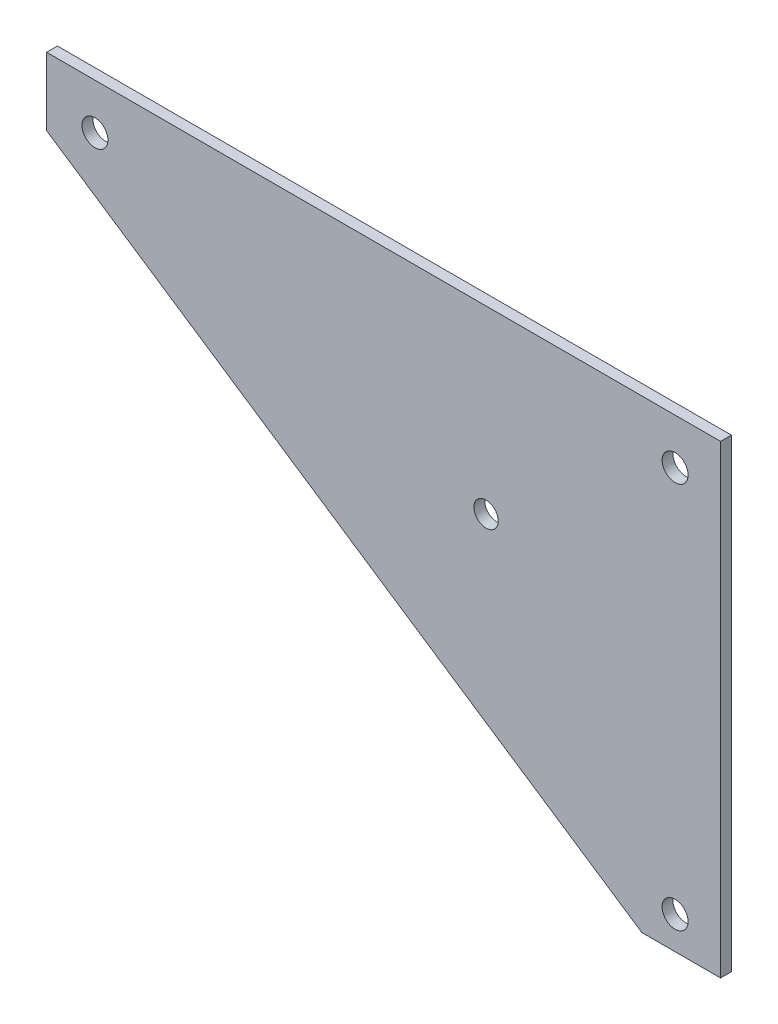
ISO-10303-21;
HEADER;
FILE_DESCRIPTION(('STEP AP214'),'2;1');
FILE_NAME('part.step','',(''),(''),'','','');
FILE_SCHEMA(('AUTOMOTIVE_DESIGN { 1 0 10303 214 1 1 1 1 }'));
ENDSEC;
DATA;
#1=APPLICATION_CONTEXT('core data for automotive mechanical design processes');
#2=APPLICATION_PROTOCOL_DEFINITION('international standard','automotive_design',2000,#1);
#3=PRODUCT_CONTEXT('',#1,'mechanical');
#4=PRODUCT('Part','Part','',(#3));
#5=PRODUCT_RELATED_PRODUCT_CATEGORY('part','',(#4));
#6=PRODUCT_DEFINITION_FORMATION('','',#4);
#7=PRODUCT_DEFINITION_CONTEXT('part definition',#1,'design');
#8=PRODUCT_DEFINITION('design','',#6,#7);
#9=PRODUCT_DEFINITION_SHAPE('','',#8);
#10=(LENGTH_UNIT() NAMED_UNIT(*) SI_UNIT(.MILLI.,.METRE.));
#11=(NAMED_UNIT(*) PLANE_ANGLE_UNIT() SI_UNIT($,.RADIAN.));
#12=(NAMED_UNIT(*) SI_UNIT($,.STERADIAN.) SOLID_ANGLE_UNIT());
#13=UNCERTAINTY_MEASURE_WITH_UNIT(LENGTH_MEASURE(1.E-05),#10,'distance_accuracy_value','');
#14=(GEOMETRIC_REPRESENTATION_CONTEXT(3) GLOBAL_UNCERTAINTY_ASSIGNED_CONTEXT((#13)) GLOBAL_UNIT_ASSIGNED_CONTEXT((#10,
#11,#12)) REPRESENTATION_CONTEXT('',''));
#15=CARTESIAN_POINT('',(0.,0.,0.));
#16=DIRECTION('',(0.,0.,1.));
#17=DIRECTION('',(1.,0.,0.));
#18=AXIS2_PLACEMENT_3D('',#15,#16,#17);
#19=CARTESIAN_POINT('',(-9.31896329658385,-13.9784449448758,4.));
#20=DIRECTION('',(-0.554700196225228,-0.832050294337844,0.));
#21=DIRECTION('',(0.832050294337844,-0.554700196225228,0.));
#22=AXIS2_PLACEMENT_3D('',#19,#20,#21);
#23=PLANE('',#22);
#24=DIRECTION('',(-0.832050294337844,0.554700196225228,0.));
#25=VECTOR('',#24,1.);
#26=CARTESIAN_POINT('',(-9.31896329658385,-13.9784449448758,0.));
#27=LINE('',#26,#25);
#28=CARTESIAN_POINT('',(94.8562264289598,-83.4285714285714,0.));
#29=VERTEX_POINT('',#28);
#30=CARTESIAN_POINT('',(-125.,63.1422461907349,0.));
#31=VERTEX_POINT('',#30);
#32=EDGE_CURVE('E123',#29,#31,#27,.T.);
#33=ORIENTED_EDGE('',*,*,#32,.F.);
#34=DIRECTION('',(0.,0.,-1.));
#35=VECTOR('',#34,1.);
#36=CARTESIAN_POINT('',(94.8562264289598,-83.4285714285714,4.));
#37=LINE('',#36,#35);
#38=CARTESIAN_POINT('',(94.8562264289598,-83.4285714285714,4.));
#39=VERTEX_POINT('',#38);
#40=EDGE_CURVE('E11',#39,#29,#37,.T.);
#41=ORIENTED_EDGE('',*,*,#40,.F.);
#42=DIRECTION('',(-0.832050294337844,0.554700196225228,0.));
#43=VECTOR('',#42,1.);
#44=CARTESIAN_POINT('',(-9.31896329658385,-13.9784449448758,4.));
#45=LINE('',#44,#43);
#46=CARTESIAN_POINT('',(-125.,63.1422461907349,4.));
#47=VERTEX_POINT('',#46);
#48=EDGE_CURVE('E142',#39,#47,#45,.T.);
#49=ORIENTED_EDGE('',*,*,#48,.T.);
#50=DIRECTION('',(0.,0.,-1.));
#51=VECTOR('',#50,1.);
#52=CARTESIAN_POINT('',(-125.,63.1422461907349,4.));
#53=LINE('',#52,#51);
#54=EDGE_CURVE('E79',#47,#31,#53,.T.);
#55=ORIENTED_EDGE('',*,*,#54,.T.);
#56=EDGE_LOOP('',(#33,#41,#49,#55));
#57=FACE_BOUND('',#56,.T.);
#58=ADVANCED_FACE('F37',(#57),#23,.T.);
#59=CARTESIAN_POINT('',(2.38832202213429E-13,-83.4285714285717,4.));
#60=DIRECTION('',(0.,-1.,0.));
#61=DIRECTION('',(1.,0.,0.));
#62=AXIS2_PLACEMENT_3D('',#59,#60,#61);
#63=PLANE('',#62);
#64=DIRECTION('',(-1.,0.,0.));
#65=VECTOR('',#64,1.);
#66=CARTESIAN_POINT('',(2.38832202213429E-13,-83.4285714285717,0.));
#67=LINE('',#66,#65);
#68=CARTESIAN_POINT('',(123.942857142857,-83.4285714285713,0.));
#69=VERTEX_POINT('',#68);
#70=EDGE_CURVE('E126',#69,#29,#67,.T.);
#71=ORIENTED_EDGE('',*,*,#70,.F.);
#72=DIRECTION('',(0.,0.,-1.));
#73=VECTOR('',#72,1.);
#74=CARTESIAN_POINT('',(123.942857142857,-83.4285714285713,4.));
#75=LINE('',#74,#73);
#76=CARTESIAN_POINT('',(123.942857142857,-83.4285714285713,4.));
#77=VERTEX_POINT('',#76);
#78=EDGE_CURVE('E46',#77,#69,#75,.T.);
#79=ORIENTED_EDGE('',*,*,#78,.F.);
#80=DIRECTION('',(-1.,0.,0.));
#81=VECTOR('',#80,1.);
#82=CARTESIAN_POINT('',(2.38832202213429E-13,-83.4285714285717,4.));
#83=LINE('',#82,#81);
#84=EDGE_CURVE('E104',#77,#39,#83,.T.);
#85=ORIENTED_EDGE('',*,*,#84,.T.);
#86=ORIENTED_EDGE('',*,*,#40,.T.);
#87=EDGE_LOOP('',(#71,#79,#85,#86));
#88=FACE_BOUND('',#87,.T.);
#89=ADVANCED_FACE('F138',(#88),#63,.T.);
#90=CARTESIAN_POINT('',(123.942857142857,0.,4.));
#91=DIRECTION('',(1.,0.,0.));
#92=DIRECTION('',(0.,1.,0.));
#93=AXIS2_PLACEMENT_3D('',#90,#91,#92);
#94=PLANE('',#93);
#95=DIRECTION('',(0.,-1.,0.));
#96=VECTOR('',#95,1.);
#97=CARTESIAN_POINT('',(123.942857142857,0.,0.));
#98=LINE('',#97,#96);
#99=CARTESIAN_POINT('',(123.942857142857,88.2285714285714,0.));
#100=VERTEX_POINT('',#99);
#101=EDGE_CURVE('E94',#100,#69,#98,.T.);
#102=ORIENTED_EDGE('',*,*,#101,.F.);
#103=DIRECTION('',(0.,0.,-1.));
#104=VECTOR('',#103,1.);
#105=CARTESIAN_POINT('',(123.942857142857,88.2285714285714,4.));
#106=LINE('',#105,#104);
#107=CARTESIAN_POINT('',(123.942857142857,88.2285714285714,4.));
#108=VERTEX_POINT('',#107);
#109=EDGE_CURVE('E89',#108,#100,#106,.T.);
#110=ORIENTED_EDGE('',*,*,#109,.F.);
#111=DIRECTION('',(0.,-1.,0.));
#112=VECTOR('',#111,1.);
#113=CARTESIAN_POINT('',(123.942857142857,0.,4.));
#114=LINE('',#113,#112);
#115=EDGE_CURVE('E92',#108,#77,#114,.T.);
#116=ORIENTED_EDGE('',*,*,#115,.T.);
#117=ORIENTED_EDGE('',*,*,#78,.T.);
#118=EDGE_LOOP('',(#102,#110,#116,#117));
#119=FACE_BOUND('',#118,.T.);
#120=ADVANCED_FACE('F91',(#119),#94,.T.);
#121=CARTESIAN_POINT('',(0.,88.2285714285713,4.));
#122=DIRECTION('',(0.,1.,0.));
#123=DIRECTION('',(-1.,0.,0.));
#124=AXIS2_PLACEMENT_3D('',#121,#122,#123);
#125=PLANE('',#124);
#126=DIRECTION('',(1.,0.,0.));
#127=VECTOR('',#126,1.);
#128=CARTESIAN_POINT('',(0.,88.2285714285713,0.));
#129=LINE('',#128,#127);
#130=CARTESIAN_POINT('',(-125.,88.2285714285713,0.));
#131=VERTEX_POINT('',#130);
#132=EDGE_CURVE('E130',#131,#100,#129,.T.);
#133=ORIENTED_EDGE('',*,*,#132,.F.);
#134=DIRECTION('',(0.,0.,-1.));
#135=VECTOR('',#134,1.);
#136=CARTESIAN_POINT('',(-125.,88.2285714285713,4.));
#137=LINE('',#136,#135);
#138=CARTESIAN_POINT('',(-125.,88.2285714285713,4.));
#139=VERTEX_POINT('',#138);
#140=EDGE_CURVE('E72',#139,#131,#137,.T.);
#141=ORIENTED_EDGE('',*,*,#140,.F.);
#142=DIRECTION('',(1.,0.,0.));
#143=VECTOR('',#142,1.);
#144=CARTESIAN_POINT('',(0.,88.2285714285713,4.));
#145=LINE('',#144,#143);
#146=EDGE_CURVE('E102',#139,#108,#145,.T.);
#147=ORIENTED_EDGE('',*,*,#146,.T.);
#148=ORIENTED_EDGE('',*,*,#109,.T.);
#149=EDGE_LOOP('',(#133,#141,#147,#148));
#150=FACE_BOUND('',#149,.T.);
#151=ADVANCED_FACE('F106',(#150),#125,.T.);
#152=CARTESIAN_POINT('',(107.142857142857,71.4285714285714,4.));
#153=DIRECTION('',(0.,0.,-1.));
#154=DIRECTION('',(-1.,0.,0.));
#155=AXIS2_PLACEMENT_3D('',#152,#153,#154);
#156=CYLINDRICAL_SURFACE('',#155,4.8);
#157=CARTESIAN_POINT('',(107.142857142857,71.4285714285714,4.));
#158=DIRECTION('',(0.,0.,1.));
#159=DIRECTION('',(1.,0.,0.));
#160=AXIS2_PLACEMENT_3D('',#157,#158,#159);
#161=CIRCLE('',#160,4.8);
#162=CARTESIAN_POINT('',(111.942857142857,71.4285714285714,4.));
#163=VERTEX_POINT('',#162);
#164=EDGE_CURVE('E143',#163,#163,#161,.T.);
#165=ORIENTED_EDGE('',*,*,#164,.T.);
#166=EDGE_LOOP('',(#165));
#167=FACE_BOUND('',#166,.T.);
#168=CARTESIAN_POINT('',(107.142857142857,71.4285714285714,0.));
#169=DIRECTION('',(0.,0.,1.));
#170=DIRECTION('',(1.,0.,0.));
#171=AXIS2_PLACEMENT_3D('',#168,#169,#170);
#172=CIRCLE('',#171,4.8);
#173=CARTESIAN_POINT('',(111.942857142857,71.4285714285714,0.));
#174=VERTEX_POINT('',#173);
#175=EDGE_CURVE('E120',#174,#174,#172,.T.);
#176=ORIENTED_EDGE('',*,*,#175,.F.);
#177=EDGE_LOOP('',(#176));
#178=FACE_BOUND('',#177,.T.);
#179=ADVANCED_FACE('F168',(#167,#178),#156,.F.);
#180=CARTESIAN_POINT('',(107.142857142857,-71.4285714285714,4.));
#181=DIRECTION('',(0.,0.,-1.));
#182=DIRECTION('',(-1.,0.,0.));
#183=AXIS2_PLACEMENT_3D('',#180,#181,#182);
#184=CYLINDRICAL_SURFACE('',#183,4.8);
#185=CARTESIAN_POINT('',(107.142857142857,-71.4285714285714,4.));
#186=DIRECTION('',(0.,0.,1.));
#187=DIRECTION('',(1.,0.,0.));
#188=AXIS2_PLACEMENT_3D('',#185,#186,#187);
#189=CIRCLE('',#188,4.8);
#190=CARTESIAN_POINT('',(111.942857142857,-71.4285714285714,4.));
#191=VERTEX_POINT('',#190);
#192=EDGE_CURVE('E146',#191,#191,#189,.T.);
#193=ORIENTED_EDGE('',*,*,#192,.T.);
#194=EDGE_LOOP('',(#193));
#195=FACE_BOUND('',#194,.T.);
#196=CARTESIAN_POINT('',(107.142857142857,-71.4285714285714,0.));
#197=DIRECTION('',(0.,0.,1.));
#198=DIRECTION('',(1.,0.,0.));
#199=AXIS2_PLACEMENT_3D('',#196,#197,#198);
#200=CIRCLE('',#199,4.8);
#201=CARTESIAN_POINT('',(111.942857142857,-71.4285714285714,0.));
#202=VERTEX_POINT('',#201);
#203=EDGE_CURVE('E117',#202,#202,#200,.T.);
#204=ORIENTED_EDGE('',*,*,#203,.F.);
#205=EDGE_LOOP('',(#204));
#206=FACE_BOUND('',#205,.T.);
#207=ADVANCED_FACE('F171',(#195,#206),#184,.F.);
#208=CARTESIAN_POINT('',(-107.142857142857,71.4285714285713,4.));
#209=DIRECTION('',(0.,0.,-1.));
#210=DIRECTION('',(-1.,0.,0.));
#211=AXIS2_PLACEMENT_3D('',#208,#209,#210);
#212=CYLINDRICAL_SURFACE('',#211,4.8);
#213=CARTESIAN_POINT('',(-107.142857142857,71.4285714285713,4.));
#214=DIRECTION('',(0.,0.,1.));
#215=DIRECTION('',(1.,0.,0.));
#216=AXIS2_PLACEMENT_3D('',#213,#214,#215);
#217=CIRCLE('',#216,4.8);
#218=CARTESIAN_POINT('',(-102.342857142857,71.4285714285713,4.));
#219=VERTEX_POINT('',#218);
#220=EDGE_CURVE('E151',#219,#219,#217,.T.);
#221=ORIENTED_EDGE('',*,*,#220,.T.);
#222=EDGE_LOOP('',(#221));
#223=FACE_BOUND('',#222,.T.);
#224=CARTESIAN_POINT('',(-107.142857142857,71.4285714285713,0.));
#225=DIRECTION('',(0.,0.,1.));
#226=DIRECTION('',(1.,0.,0.));
#227=AXIS2_PLACEMENT_3D('',#224,#225,#226);
#228=CIRCLE('',#227,4.8);
#229=CARTESIAN_POINT('',(-102.342857142857,71.4285714285713,0.));
#230=VERTEX_POINT('',#229);
#231=EDGE_CURVE('E114',#230,#230,#228,.T.);
#232=ORIENTED_EDGE('',*,*,#231,.F.);
#233=EDGE_LOOP('',(#232));
#234=FACE_BOUND('',#233,.T.);
#235=ADVANCED_FACE('F191',(#223,#234),#212,.F.);
#236=CARTESIAN_POINT('',(37.332408691632,21.6520265063954,4.));
#237=DIRECTION('',(0.,0.,-1.));
#238=DIRECTION('',(-1.,0.,0.));
#239=AXIS2_PLACEMENT_3D('',#236,#237,#238);
#240=CYLINDRICAL_SURFACE('',#239,4.5);
#241=CARTESIAN_POINT('',(37.332408691632,21.6520265063954,4.));
#242=DIRECTION('',(0.,0.,1.));
#243=DIRECTION('',(1.,0.,0.));
#244=AXIS2_PLACEMENT_3D('',#241,#242,#243);
#245=CIRCLE('',#244,4.5);
#246=CARTESIAN_POINT('',(41.832408691632,21.6520265063954,4.));
#247=VERTEX_POINT('',#246);
#248=EDGE_CURVE('E134',#247,#247,#245,.T.);
#249=ORIENTED_EDGE('',*,*,#248,.T.);
#250=EDGE_LOOP('',(#249));
#251=FACE_BOUND('',#250,.T.);
#252=CARTESIAN_POINT('',(37.332408691632,21.6520265063954,0.));
#253=DIRECTION('',(0.,0.,1.));
#254=DIRECTION('',(1.,0.,0.));
#255=AXIS2_PLACEMENT_3D('',#252,#253,#254);
#256=CIRCLE('',#255,4.5);
#257=CARTESIAN_POINT('',(41.832408691632,21.6520265063954,0.));
#258=VERTEX_POINT('',#257);
#259=EDGE_CURVE('E111',#258,#258,#256,.T.);
#260=ORIENTED_EDGE('',*,*,#259,.F.);
#261=EDGE_LOOP('',(#260));
#262=FACE_BOUND('',#261,.T.);
#263=ADVANCED_FACE('F39',(#251,#262),#240,.F.);
#264=CARTESIAN_POINT('',(-125.,0.,4.));
#265=DIRECTION('',(1.,0.,0.));
#266=DIRECTION('',(0.,1.,0.));
#267=AXIS2_PLACEMENT_3D('',#264,#265,#266);
#268=PLANE('',#267);
#269=DIRECTION('',(0.,-1.,0.));
#270=VECTOR('',#269,1.);
#271=CARTESIAN_POINT('',(-125.,0.,0.));
#272=LINE('',#271,#270);
#273=EDGE_CURVE('E132',#131,#31,#272,.T.);
#274=ORIENTED_EDGE('',*,*,#273,.T.);
#275=ORIENTED_EDGE('',*,*,#54,.F.);
#276=DIRECTION('',(0.,-1.,0.));
#277=VECTOR('',#276,1.);
#278=CARTESIAN_POINT('',(-125.,0.,4.));
#279=LINE('',#278,#277);
#280=EDGE_CURVE('E54',#139,#47,#279,.T.);
#281=ORIENTED_EDGE('',*,*,#280,.F.);
#282=ORIENTED_EDGE('',*,*,#140,.T.);
#283=EDGE_LOOP('',(#274,#275,#281,#282));
#284=FACE_BOUND('',#283,.T.);
#285=ADVANCED_FACE('F141',(#284),#268,.F.);
#286=CARTESIAN_POINT('',(0.,0.,4.));
#287=DIRECTION('',(0.,0.,1.));
#288=DIRECTION('',(1.,0.,0.));
#289=AXIS2_PLACEMENT_3D('',#286,#287,#288);
#290=PLANE('',#289);
#291=ORIENTED_EDGE('',*,*,#248,.F.);
#292=EDGE_LOOP('',(#291));
#293=FACE_BOUND('',#292,.T.);
#294=ORIENTED_EDGE('',*,*,#220,.F.);
#295=EDGE_LOOP('',(#294));
#296=FACE_BOUND('',#295,.T.);
#297=ORIENTED_EDGE('',*,*,#192,.F.);
#298=EDGE_LOOP('',(#297));
#299=FACE_BOUND('',#298,.T.);
#300=ORIENTED_EDGE('',*,*,#164,.F.);
#301=EDGE_LOOP('',(#300));
#302=FACE_BOUND('',#301,.T.);
#303=ORIENTED_EDGE('',*,*,#48,.F.);
#304=ORIENTED_EDGE('',*,*,#84,.F.);
#305=ORIENTED_EDGE('',*,*,#115,.F.);
#306=ORIENTED_EDGE('',*,*,#146,.F.);
#307=ORIENTED_EDGE('',*,*,#280,.T.);
#308=EDGE_LOOP('',(#303,#304,#305,#306,#307));
#309=FACE_BOUND('',#308,.T.);
#310=ADVANCED_FACE('F101',(#293,#296,#299,#302,#309),#290,.T.);
#311=CARTESIAN_POINT('',(0.,0.,0.));
#312=DIRECTION('',(0.,0.,1.));
#313=DIRECTION('',(1.,0.,0.));
#314=AXIS2_PLACEMENT_3D('',#311,#312,#313);
#315=PLANE('',#314);
#316=ORIENTED_EDGE('',*,*,#259,.T.);
#317=EDGE_LOOP('',(#316));
#318=FACE_BOUND('',#317,.T.);
#319=ORIENTED_EDGE('',*,*,#231,.T.);
#320=EDGE_LOOP('',(#319));
#321=FACE_BOUND('',#320,.T.);
#322=ORIENTED_EDGE('',*,*,#203,.T.);
#323=EDGE_LOOP('',(#322));
#324=FACE_BOUND('',#323,.T.);
#325=ORIENTED_EDGE('',*,*,#175,.T.);
#326=EDGE_LOOP('',(#325));
#327=FACE_BOUND('',#326,.T.);
#328=ORIENTED_EDGE('',*,*,#32,.T.);
#329=ORIENTED_EDGE('',*,*,#273,.F.);
#330=ORIENTED_EDGE('',*,*,#132,.T.);
#331=ORIENTED_EDGE('',*,*,#101,.T.);
#332=ORIENTED_EDGE('',*,*,#70,.T.);
#333=EDGE_LOOP('',(#328,#329,#330,#331,#332));
#334=FACE_BOUND('',#333,.T.);
#335=ADVANCED_FACE('F140',(#318,#321,#324,#327,#334),#315,.F.);
#336=CLOSED_SHELL('',(#58,#89,#120,#151,#179,#207,#235,#263,#285,#310,#335));
#337=MANIFOLD_SOLID_BREP('B2',#336);
#338=ADVANCED_BREP_SHAPE_REPRESENTATION('',(#18,#337),#14);
#339=SHAPE_DEFINITION_REPRESENTATION(#9,#338);
ENDSEC;
END-ISO-10303-21;
